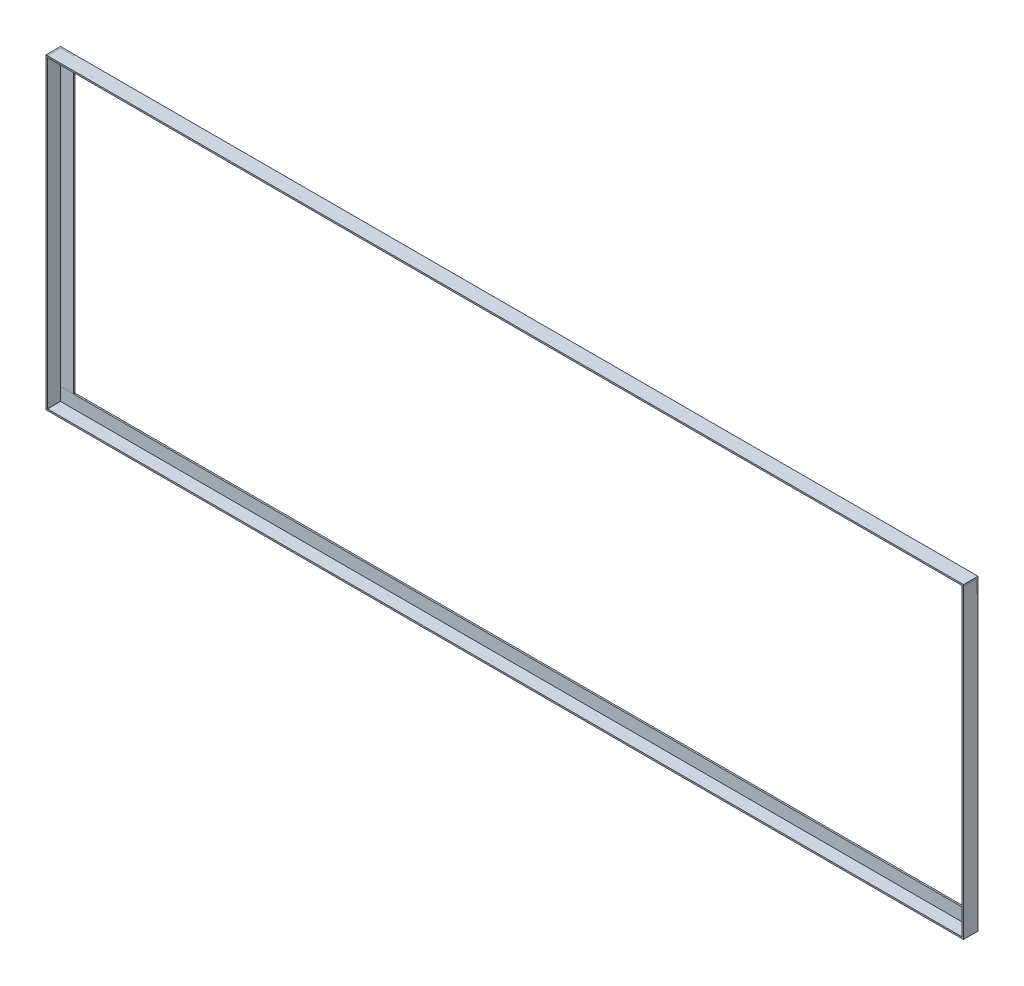
ISO-10303-21;
HEADER;
FILE_DESCRIPTION(('STEP AP214'),'2;1');
FILE_NAME('part.step','',(''),(''),'','','');
FILE_SCHEMA(('AUTOMOTIVE_DESIGN { 1 0 10303 214 1 1 1 1 }'));
ENDSEC;
DATA;
#1=APPLICATION_CONTEXT('core data for automotive mechanical design processes');
#2=APPLICATION_PROTOCOL_DEFINITION('international standard','automotive_design',2000,#1);
#3=PRODUCT_CONTEXT('',#1,'mechanical');
#4=PRODUCT('Part','Part','',(#3));
#5=PRODUCT_RELATED_PRODUCT_CATEGORY('part','',(#4));
#6=PRODUCT_DEFINITION_FORMATION('','',#4);
#7=PRODUCT_DEFINITION_CONTEXT('part definition',#1,'design');
#8=PRODUCT_DEFINITION('design','',#6,#7);
#9=PRODUCT_DEFINITION_SHAPE('','',#8);
#10=(LENGTH_UNIT() NAMED_UNIT(*) SI_UNIT(.MILLI.,.METRE.));
#11=(NAMED_UNIT(*) PLANE_ANGLE_UNIT() SI_UNIT($,.RADIAN.));
#12=(NAMED_UNIT(*) SI_UNIT($,.STERADIAN.) SOLID_ANGLE_UNIT());
#13=UNCERTAINTY_MEASURE_WITH_UNIT(LENGTH_MEASURE(1.E-05),#10,'distance_accuracy_value','');
#14=(GEOMETRIC_REPRESENTATION_CONTEXT(3) GLOBAL_UNCERTAINTY_ASSIGNED_CONTEXT((#13)) GLOBAL_UNIT_ASSIGNED_CONTEXT((#10,
#11,#12)) REPRESENTATION_CONTEXT('',''));
#15=CARTESIAN_POINT('',(0.,0.,0.));
#16=DIRECTION('',(0.,0.,1.));
#17=DIRECTION('',(1.,0.,0.));
#18=AXIS2_PLACEMENT_3D('',#15,#16,#17);
#19=CARTESIAN_POINT('',(0.,0.,0.));
#20=DIRECTION('',(0.,0.,-1.));
#21=DIRECTION('',(-1.,0.,0.));
#22=AXIS2_PLACEMENT_3D('',#19,#20,#21);
#23=PLANE('',#22);
#24=DIRECTION('',(1.,0.,0.));
#25=VECTOR('',#24,1.);
#26=CARTESIAN_POINT('',(0.,402.,0.));
#27=LINE('',#26,#25);
#28=CARTESIAN_POINT('',(0.,402.,0.));
#29=VERTEX_POINT('',#28);
#30=CARTESIAN_POINT('',(17.05,402.,0.));
#31=VERTEX_POINT('',#30);
#32=EDGE_CURVE('E153',#29,#31,#27,.T.);
#33=ORIENTED_EDGE('',*,*,#32,.F.);
#34=DIRECTION('',(0.,1.,0.));
#35=VECTOR('',#34,1.);
#36=CARTESIAN_POINT('',(0.,0.,0.));
#37=LINE('',#36,#35);
#38=CARTESIAN_POINT('',(0.,17.05,0.));
#39=VERTEX_POINT('',#38);
#40=EDGE_CURVE('E79',#39,#29,#37,.T.);
#41=ORIENTED_EDGE('',*,*,#40,.F.);
#42=DIRECTION('',(-1.,0.,0.));
#43=VECTOR('',#42,1.);
#44=CARTESIAN_POINT('',(0.,17.05,0.));
#45=LINE('',#44,#43);
#46=CARTESIAN_POINT('',(17.05,17.05,0.));
#47=VERTEX_POINT('',#46);
#48=EDGE_CURVE('E157',#47,#39,#45,.T.);
#49=ORIENTED_EDGE('',*,*,#48,.F.);
#50=DIRECTION('',(0.,1.,0.));
#51=VECTOR('',#50,1.);
#52=CARTESIAN_POINT('',(17.05,0.,0.));
#53=LINE('',#52,#51);
#54=EDGE_CURVE('E185',#47,#31,#53,.T.);
#55=ORIENTED_EDGE('',*,*,#54,.T.);
#56=EDGE_LOOP('',(#33,#41,#49,#55));
#57=FACE_BOUND('',#56,.T.);
#58=ADVANCED_FACE('F75',(#57),#23,.F.);
#59=CARTESIAN_POINT('',(17.05,0.,0.));
#60=DIRECTION('',(-1.,0.,0.));
#61=DIRECTION('',(0.,0.,1.));
#62=AXIS2_PLACEMENT_3D('',#59,#60,#61);
#63=PLANE('',#62);
#64=DIRECTION('',(0.,0.,-1.));
#65=VECTOR('',#64,1.);
#66=CARTESIAN_POINT('',(17.05,402.,0.));
#67=LINE('',#66,#65);
#68=CARTESIAN_POINT('',(17.05,402.,-2.));
#69=VERTEX_POINT('',#68);
#70=EDGE_CURVE('E172',#31,#69,#67,.T.);
#71=ORIENTED_EDGE('',*,*,#70,.F.);
#72=ORIENTED_EDGE('',*,*,#54,.F.);
#73=DIRECTION('',(0.,0.,1.));
#74=VECTOR('',#73,1.);
#75=CARTESIAN_POINT('',(17.05,17.05,0.));
#76=LINE('',#75,#74);
#77=CARTESIAN_POINT('',(17.05,17.05,-2.));
#78=VERTEX_POINT('',#77);
#79=EDGE_CURVE('E112',#78,#47,#76,.T.);
#80=ORIENTED_EDGE('',*,*,#79,.F.);
#81=DIRECTION('',(0.,1.,0.));
#82=VECTOR('',#81,1.);
#83=CARTESIAN_POINT('',(17.05,0.,-2.));
#84=LINE('',#83,#82);
#85=EDGE_CURVE('E165',#78,#69,#84,.T.);
#86=ORIENTED_EDGE('',*,*,#85,.T.);
#87=EDGE_LOOP('',(#71,#72,#80,#86));
#88=FACE_BOUND('',#87,.T.);
#89=ADVANCED_FACE('F212',(#88),#63,.F.);
#90=CARTESIAN_POINT('',(17.05,0.,-2.));
#91=DIRECTION('',(0.,0.,1.));
#92=DIRECTION('',(1.,0.,0.));
#93=AXIS2_PLACEMENT_3D('',#90,#91,#92);
#94=PLANE('',#93);
#95=DIRECTION('',(-1.,0.,0.));
#96=VECTOR('',#95,1.);
#97=CARTESIAN_POINT('',(17.0500000000001,402.,-2.));
#98=LINE('',#97,#96);
#99=CARTESIAN_POINT('',(-2.,402.,-2.));
#100=VERTEX_POINT('',#99);
#101=EDGE_CURVE('E169',#69,#100,#98,.T.);
#102=ORIENTED_EDGE('',*,*,#101,.F.);
#103=ORIENTED_EDGE('',*,*,#85,.F.);
#104=DIRECTION('',(-1.,0.,0.));
#105=VECTOR('',#104,1.);
#106=CARTESIAN_POINT('',(1202.,17.05,-1.99999999999992));
#107=LINE('',#106,#105);
#108=CARTESIAN_POINT('',(-2.,17.05,-2.));
#109=VERTEX_POINT('',#108);
#110=EDGE_CURVE('E109',#78,#109,#107,.T.);
#111=ORIENTED_EDGE('',*,*,#110,.T.);
#112=DIRECTION('',(0.,1.,0.));
#113=VECTOR('',#112,1.);
#114=CARTESIAN_POINT('',(-2.,0.,-2.));
#115=LINE('',#114,#113);
#116=EDGE_CURVE('E164',#109,#100,#115,.T.);
#117=ORIENTED_EDGE('',*,*,#116,.T.);
#118=EDGE_LOOP('',(#102,#103,#111,#117));
#119=FACE_BOUND('',#118,.T.);
#120=ADVANCED_FACE('F210',(#119),#94,.F.);
#121=CARTESIAN_POINT('',(-2.,0.,-2.));
#122=DIRECTION('',(1.,0.,0.));
#123=DIRECTION('',(0.,0.,-1.));
#124=AXIS2_PLACEMENT_3D('',#121,#122,#123);
#125=PLANE('',#124);
#126=DIRECTION('',(0.,0.,1.));
#127=VECTOR('',#126,1.);
#128=CARTESIAN_POINT('',(-2.,402.,-2.));
#129=LINE('',#128,#127);
#130=CARTESIAN_POINT('',(-2.,402.,17.05));
#131=VERTEX_POINT('',#130);
#132=EDGE_CURVE('E85',#100,#131,#129,.T.);
#133=ORIENTED_EDGE('',*,*,#132,.F.);
#134=ORIENTED_EDGE('',*,*,#116,.F.);
#135=DIRECTION('',(0.,0.,-1.));
#136=VECTOR('',#135,1.);
#137=CARTESIAN_POINT('',(-2.,17.05,-2.));
#138=LINE('',#137,#136);
#139=CARTESIAN_POINT('',(-2.,17.05,0.));
#140=VERTEX_POINT('',#139);
#141=EDGE_CURVE('E139',#140,#109,#138,.T.);
#142=ORIENTED_EDGE('',*,*,#141,.F.);
#143=DIRECTION('',(0.,1.,0.));
#144=VECTOR('',#143,1.);
#145=CARTESIAN_POINT('',(-2.,0.,0.));
#146=LINE('',#145,#144);
#147=CARTESIAN_POINT('',(-2.,0.,0.));
#148=VERTEX_POINT('',#147);
#149=EDGE_CURVE('E142',#148,#140,#146,.T.);
#150=ORIENTED_EDGE('',*,*,#149,.F.);
#151=DIRECTION('',(0.,0.,-1.));
#152=VECTOR('',#151,1.);
#153=CARTESIAN_POINT('',(-2.,0.,-2.));
#154=LINE('',#153,#152);
#155=CARTESIAN_POINT('',(-2.,0.,17.05));
#156=VERTEX_POINT('',#155);
#157=EDGE_CURVE('E128',#156,#148,#154,.T.);
#158=ORIENTED_EDGE('',*,*,#157,.F.);
#159=DIRECTION('',(0.,1.,0.));
#160=VECTOR('',#159,1.);
#161=CARTESIAN_POINT('',(-2.,0.,17.05));
#162=LINE('',#161,#160);
#163=EDGE_CURVE('E180',#156,#131,#162,.T.);
#164=ORIENTED_EDGE('',*,*,#163,.T.);
#165=EDGE_LOOP('',(#133,#134,#142,#150,#158,#164));
#166=FACE_BOUND('',#165,.T.);
#167=ADVANCED_FACE('F148',(#166),#125,.F.);
#168=CARTESIAN_POINT('',(-2.,0.,17.05));
#169=DIRECTION('',(0.,0.,-1.));
#170=DIRECTION('',(-1.,0.,0.));
#171=AXIS2_PLACEMENT_3D('',#168,#169,#170);
#172=PLANE('',#171);
#173=DIRECTION('',(1.,0.,0.));
#174=VECTOR('',#173,1.);
#175=CARTESIAN_POINT('',(-1.99999999999993,402.,17.05));
#176=LINE('',#175,#174);
#177=CARTESIAN_POINT('',(0.,402.,17.05));
#178=VERTEX_POINT('',#177);
#179=EDGE_CURVE('E14',#131,#178,#176,.T.);
#180=ORIENTED_EDGE('',*,*,#179,.F.);
#181=ORIENTED_EDGE('',*,*,#163,.F.);
#182=DIRECTION('',(-1.,0.,0.));
#183=VECTOR('',#182,1.);
#184=CARTESIAN_POINT('',(1202.,0.,17.0500000000001));
#185=LINE('',#184,#183);
#186=CARTESIAN_POINT('',(0.,0.,17.05));
#187=VERTEX_POINT('',#186);
#188=EDGE_CURVE('E134',#187,#156,#185,.T.);
#189=ORIENTED_EDGE('',*,*,#188,.F.);
#190=DIRECTION('',(0.,1.,0.));
#191=VECTOR('',#190,1.);
#192=CARTESIAN_POINT('',(0.,0.,17.05));
#193=LINE('',#192,#191);
#194=EDGE_CURVE('E177',#187,#178,#193,.T.);
#195=ORIENTED_EDGE('',*,*,#194,.T.);
#196=EDGE_LOOP('',(#180,#181,#189,#195));
#197=FACE_BOUND('',#196,.T.);
#198=ADVANCED_FACE('F223',(#197),#172,.F.);
#199=CARTESIAN_POINT('',(0.,0.,17.05));
#200=DIRECTION('',(-1.,0.,0.));
#201=DIRECTION('',(0.,0.,1.));
#202=AXIS2_PLACEMENT_3D('',#199,#200,#201);
#203=PLANE('',#202);
#204=DIRECTION('',(0.,0.,-1.));
#205=VECTOR('',#204,1.);
#206=CARTESIAN_POINT('',(0.,402.,17.05));
#207=LINE('',#206,#205);
#208=EDGE_CURVE('E150',#178,#29,#207,.T.);
#209=ORIENTED_EDGE('',*,*,#208,.F.);
#210=ORIENTED_EDGE('',*,*,#194,.F.);
#211=DIRECTION('',(0.,0.,1.));
#212=VECTOR('',#211,1.);
#213=CARTESIAN_POINT('',(0.,0.,17.05));
#214=LINE('',#213,#212);
#215=CARTESIAN_POINT('',(0.,0.,0.));
#216=VERTEX_POINT('',#215);
#217=EDGE_CURVE('E158',#216,#187,#214,.T.);
#218=ORIENTED_EDGE('',*,*,#217,.F.);
#219=EDGE_CURVE('E144',#216,#39,#37,.T.);
#220=ORIENTED_EDGE('',*,*,#219,.T.);
#221=ORIENTED_EDGE('',*,*,#40,.T.);
#222=EDGE_LOOP('',(#209,#210,#218,#220,#221));
#223=FACE_BOUND('',#222,.T.);
#224=ADVANCED_FACE('F203',(#223),#203,.F.);
#225=CARTESIAN_POINT('',(1202.,0.,17.0500000000001));
#226=DIRECTION('',(0.,-1.,0.));
#227=DIRECTION('',(0.,0.,-1.));
#228=AXIS2_PLACEMENT_3D('',#225,#226,#227);
#229=PLANE('',#228);
#230=ORIENTED_EDGE('',*,*,#217,.T.);
#231=ORIENTED_EDGE('',*,*,#188,.T.);
#232=ORIENTED_EDGE('',*,*,#157,.T.);
#233=DIRECTION('',(-1.,0.,0.));
#234=VECTOR('',#233,1.);
#235=CARTESIAN_POINT('',(1202.,0.,0.));
#236=LINE('',#235,#234);
#237=EDGE_CURVE('E131',#216,#148,#236,.T.);
#238=ORIENTED_EDGE('',*,*,#237,.F.);
#239=EDGE_LOOP('',(#230,#231,#232,#238));
#240=FACE_BOUND('',#239,.T.);
#241=ADVANCED_FACE('F130',(#240),#229,.T.);
#242=CARTESIAN_POINT('',(1202.,17.05,0.));
#243=DIRECTION('',(0.,-1.,0.));
#244=DIRECTION('',(0.,0.,-1.));
#245=AXIS2_PLACEMENT_3D('',#242,#243,#244);
#246=PLANE('',#245);
#247=ORIENTED_EDGE('',*,*,#141,.T.);
#248=ORIENTED_EDGE('',*,*,#110,.F.);
#249=ORIENTED_EDGE('',*,*,#79,.T.);
#250=ORIENTED_EDGE('',*,*,#48,.T.);
#251=DIRECTION('',(-1.,0.,0.));
#252=VECTOR('',#251,1.);
#253=CARTESIAN_POINT('',(1202.,17.05,0.));
#254=LINE('',#253,#252);
#255=EDGE_CURVE('E94',#39,#140,#254,.T.);
#256=ORIENTED_EDGE('',*,*,#255,.T.);
#257=EDGE_LOOP('',(#247,#248,#249,#250,#256));
#258=FACE_BOUND('',#257,.T.);
#259=ADVANCED_FACE('F228',(#258),#246,.T.);
#260=CARTESIAN_POINT('',(1202.,0.,0.));
#261=DIRECTION('',(0.,0.,-1.));
#262=DIRECTION('',(-1.,0.,0.));
#263=AXIS2_PLACEMENT_3D('',#260,#261,#262);
#264=PLANE('',#263);
#265=ORIENTED_EDGE('',*,*,#219,.F.);
#266=ORIENTED_EDGE('',*,*,#237,.T.);
#267=ORIENTED_EDGE('',*,*,#149,.T.);
#268=ORIENTED_EDGE('',*,*,#255,.F.);
#269=EDGE_LOOP('',(#265,#266,#267,#268));
#270=FACE_BOUND('',#269,.T.);
#271=ADVANCED_FACE('F141',(#270),#264,.T.);
#272=CARTESIAN_POINT('',(0.,402.,-2.));
#273=DIRECTION('',(0.,1.,0.));
#274=DIRECTION('',(-1.,0.,0.));
#275=AXIS2_PLACEMENT_3D('',#272,#273,#274);
#276=PLANE('',#275);
#277=ORIENTED_EDGE('',*,*,#208,.T.);
#278=ORIENTED_EDGE('',*,*,#32,.T.);
#279=ORIENTED_EDGE('',*,*,#70,.T.);
#280=ORIENTED_EDGE('',*,*,#101,.T.);
#281=ORIENTED_EDGE('',*,*,#132,.T.);
#282=ORIENTED_EDGE('',*,*,#179,.T.);
#283=EDGE_LOOP('',(#277,#278,#279,#280,#281,#282));
#284=FACE_BOUND('',#283,.T.);
#285=ADVANCED_FACE('F77',(#284),#276,.T.);
#286=CLOSED_SHELL('',(#58,#89,#120,#167,#198,#224,#241,#259,#271,#285));
#287=MANIFOLD_SOLID_BREP('B2',#286);
#288=CARTESIAN_POINT('',(1204.,400.,-1.99999999999995));
#289=DIRECTION('',(1.,0.,0.));
#290=DIRECTION('',(0.,1.,0.));
#291=AXIS2_PLACEMENT_3D('',#288,#289,#290);
#292=PLANE('',#291);
#293=DIRECTION('',(0.,-1.,0.));
#294=VECTOR('',#293,1.);
#295=CARTESIAN_POINT('',(1204.,402.,17.0500000000001));
#296=LINE('',#295,#294);
#297=CARTESIAN_POINT('',(1204.,402.,17.0500000000001));
#298=VERTEX_POINT('',#297);
#299=CARTESIAN_POINT('',(1204.,400.,17.0500000000001));
#300=VERTEX_POINT('',#299);
#301=EDGE_CURVE('E438',#298,#300,#296,.T.);
#302=ORIENTED_EDGE('',*,*,#301,.T.);
#303=DIRECTION('',(0.,0.,-1.));
#304=VECTOR('',#303,1.);
#305=CARTESIAN_POINT('',(1204.,400.,17.0500000000001));
#306=LINE('',#305,#304);
#307=CARTESIAN_POINT('',(1204.,400.,0.));
#308=VERTEX_POINT('',#307);
#309=EDGE_CURVE('E464',#300,#308,#306,.T.);
#310=ORIENTED_EDGE('',*,*,#309,.T.);
#311=DIRECTION('',(0.,-1.,0.));
#312=VECTOR('',#311,1.);
#313=CARTESIAN_POINT('',(1204.,400.,0.));
#314=LINE('',#313,#312);
#315=CARTESIAN_POINT('',(1204.,382.95,0.));
#316=VERTEX_POINT('',#315);
#317=EDGE_CURVE('E468',#308,#316,#314,.T.);
#318=ORIENTED_EDGE('',*,*,#317,.T.);
#319=DIRECTION('',(0.,0.,-1.));
#320=VECTOR('',#319,1.);
#321=CARTESIAN_POINT('',(1204.,382.95,0.));
#322=LINE('',#321,#320);
#323=CARTESIAN_POINT('',(1204.,382.95,-1.99999999999995));
#324=VERTEX_POINT('',#323);
#325=EDGE_CURVE('E477',#316,#324,#322,.T.);
#326=ORIENTED_EDGE('',*,*,#325,.T.);
#327=DIRECTION('',(0.,1.,0.));
#328=VECTOR('',#327,1.);
#329=CARTESIAN_POINT('',(1204.,382.95,-1.99999999999995));
#330=LINE('',#329,#328);
#331=CARTESIAN_POINT('',(1204.,402.,-1.99999999999995));
#332=VERTEX_POINT('',#331);
#333=EDGE_CURVE('E431',#324,#332,#330,.T.);
#334=ORIENTED_EDGE('',*,*,#333,.T.);
#335=DIRECTION('',(0.,0.,1.));
#336=VECTOR('',#335,1.);
#337=CARTESIAN_POINT('',(1204.,402.,-1.99999999999995));
#338=LINE('',#337,#336);
#339=EDGE_CURVE('E357',#332,#298,#338,.T.);
#340=ORIENTED_EDGE('',*,*,#339,.T.);
#341=EDGE_LOOP('',(#302,#310,#318,#326,#334,#340));
#342=FACE_BOUND('',#341,.T.);
#343=ADVANCED_FACE('F349',(#342),#292,.T.);
#344=CARTESIAN_POINT('',(-1.11022302462516E-13,400.,0.));
#345=DIRECTION('',(0.,0.,-1.));
#346=DIRECTION('',(-1.,0.,0.));
#347=AXIS2_PLACEMENT_3D('',#344,#345,#346);
#348=PLANE('',#347);
#349=DIRECTION('',(0.,1.,0.));
#350=VECTOR('',#349,1.);
#351=CARTESIAN_POINT('',(17.0499999999999,400.,0.));
#352=LINE('',#351,#350);
#353=CARTESIAN_POINT('',(17.0499999999998,382.95,0.));
#354=VERTEX_POINT('',#353);
#355=CARTESIAN_POINT('',(17.0499999999999,400.,0.));
#356=VERTEX_POINT('',#355);
#357=EDGE_CURVE('E73',#354,#356,#352,.T.);
#358=ORIENTED_EDGE('',*,*,#357,.F.);
#359=DIRECTION('',(1.,0.,0.));
#360=VECTOR('',#359,1.);
#361=CARTESIAN_POINT('',(-2.22044604925031E-13,382.95,0.));
#362=LINE('',#361,#360);
#363=EDGE_CURVE('E370',#354,#316,#362,.T.);
#364=ORIENTED_EDGE('',*,*,#363,.T.);
#365=ORIENTED_EDGE('',*,*,#317,.F.);
#366=DIRECTION('',(1.,0.,0.));
#367=VECTOR('',#366,1.);
#368=CARTESIAN_POINT('',(-1.11022302462516E-13,400.,0.));
#369=LINE('',#368,#367);
#370=EDGE_CURVE('E443',#356,#308,#369,.T.);
#371=ORIENTED_EDGE('',*,*,#370,.F.);
#372=EDGE_LOOP('',(#358,#364,#365,#371));
#373=FACE_BOUND('',#372,.T.);
#374=ADVANCED_FACE('F496',(#373),#348,.F.);
#375=CARTESIAN_POINT('',(-2.22044604925031E-13,382.95,0.));
#376=DIRECTION('',(0.,1.,0.));
#377=DIRECTION('',(0.,0.,1.));
#378=AXIS2_PLACEMENT_3D('',#375,#376,#377);
#379=PLANE('',#378);
#380=DIRECTION('',(0.,0.,1.));
#381=VECTOR('',#380,1.);
#382=CARTESIAN_POINT('',(17.0499999999998,382.95,0.));
#383=LINE('',#382,#381);
#384=CARTESIAN_POINT('',(17.0499999999999,382.95,-2.));
#385=VERTEX_POINT('',#384);
#386=EDGE_CURVE('E363',#385,#354,#383,.T.);
#387=ORIENTED_EDGE('',*,*,#386,.F.);
#388=DIRECTION('',(1.,0.,0.));
#389=VECTOR('',#388,1.);
#390=CARTESIAN_POINT('',(-2.22044604925031E-13,382.95,-2.));
#391=LINE('',#390,#389);
#392=EDGE_CURVE('E424',#385,#324,#391,.T.);
#393=ORIENTED_EDGE('',*,*,#392,.T.);
#394=ORIENTED_EDGE('',*,*,#325,.F.);
#395=ORIENTED_EDGE('',*,*,#363,.F.);
#396=EDGE_LOOP('',(#387,#393,#394,#395));
#397=FACE_BOUND('',#396,.T.);
#398=ADVANCED_FACE('F423',(#397),#379,.F.);
#399=CARTESIAN_POINT('',(-2.22044604925031E-13,382.95,-2.));
#400=DIRECTION('',(0.,0.,1.));
#401=DIRECTION('',(0.,-1.,0.));
#402=AXIS2_PLACEMENT_3D('',#399,#400,#401);
#403=PLANE('',#402);
#404=DIRECTION('',(0.,1.,0.));
#405=VECTOR('',#404,1.);
#406=CARTESIAN_POINT('',(17.0499999999999,-1.11022302462516E-13,-1.99999999999994));
#407=LINE('',#406,#405);
#408=CARTESIAN_POINT('',(17.05,402.,-2.));
#409=VERTEX_POINT('',#408);
#410=EDGE_CURVE('E410',#385,#409,#407,.T.);
#411=ORIENTED_EDGE('',*,*,#410,.T.);
#412=DIRECTION('',(1.,0.,0.));
#413=VECTOR('',#412,1.);
#414=CARTESIAN_POINT('',(-1.11022302462516E-13,402.,-2.));
#415=LINE('',#414,#413);
#416=EDGE_CURVE('E434',#409,#332,#415,.T.);
#417=ORIENTED_EDGE('',*,*,#416,.T.);
#418=ORIENTED_EDGE('',*,*,#333,.F.);
#419=ORIENTED_EDGE('',*,*,#392,.F.);
#420=EDGE_LOOP('',(#411,#417,#418,#419));
#421=FACE_BOUND('',#420,.T.);
#422=ADVANCED_FACE('F429',(#421),#403,.F.);
#423=CARTESIAN_POINT('',(-1.11022302462516E-13,402.,-2.));
#424=DIRECTION('',(0.,-1.,0.));
#425=DIRECTION('',(0.,0.,-1.));
#426=AXIS2_PLACEMENT_3D('',#423,#424,#425);
#427=PLANE('',#426);
#428=DIRECTION('',(0.,0.,-1.));
#429=VECTOR('',#428,1.);
#430=CARTESIAN_POINT('',(-1.11022302462516E-13,402.,-2.));
#431=LINE('',#430,#429);
#432=CARTESIAN_POINT('',(-1.11022302462516E-13,402.,17.05));
#433=VERTEX_POINT('',#432);
#434=CARTESIAN_POINT('',(-1.11022302462516E-13,402.,0.));
#435=VERTEX_POINT('',#434);
#436=EDGE_CURVE('E460',#433,#435,#431,.T.);
#437=ORIENTED_EDGE('',*,*,#436,.F.);
#438=DIRECTION('',(1.,0.,0.));
#439=VECTOR('',#438,1.);
#440=CARTESIAN_POINT('',(-1.11022302462516E-13,402.,17.05));
#441=LINE('',#440,#439);
#442=EDGE_CURVE('E440',#433,#298,#441,.T.);
#443=ORIENTED_EDGE('',*,*,#442,.T.);
#444=ORIENTED_EDGE('',*,*,#339,.F.);
#445=ORIENTED_EDGE('',*,*,#416,.F.);
#446=DIRECTION('',(0.,0.,-1.));
#447=VECTOR('',#446,1.);
#448=CARTESIAN_POINT('',(17.05,402.,-2.));
#449=LINE('',#448,#447);
#450=CARTESIAN_POINT('',(17.0499999999999,402.,0.));
#451=VERTEX_POINT('',#450);
#452=EDGE_CURVE('E414',#451,#409,#449,.T.);
#453=ORIENTED_EDGE('',*,*,#452,.F.);
#454=DIRECTION('',(1.,0.,0.));
#455=VECTOR('',#454,1.);
#456=CARTESIAN_POINT('',(-1.11022302462516E-13,402.,0.));
#457=LINE('',#456,#455);
#458=EDGE_CURVE('E446',#435,#451,#457,.T.);
#459=ORIENTED_EDGE('',*,*,#458,.F.);
#460=EDGE_LOOP('',(#437,#443,#444,#445,#453,#459));
#461=FACE_BOUND('',#460,.T.);
#462=ADVANCED_FACE('F490',(#461),#427,.F.);
#463=CARTESIAN_POINT('',(-1.11022302462516E-13,402.,17.05));
#464=DIRECTION('',(0.,0.,-1.));
#465=DIRECTION('',(-1.,0.,0.));
#466=AXIS2_PLACEMENT_3D('',#463,#464,#465);
#467=PLANE('',#466);
#468=DIRECTION('',(0.,1.,0.));
#469=VECTOR('',#468,1.);
#470=CARTESIAN_POINT('',(-2.22044604925031E-13,-1.11022302462516E-13,17.0500000000001));
#471=LINE('',#470,#469);
#472=CARTESIAN_POINT('',(-2.22044604925031E-13,400.,17.05));
#473=VERTEX_POINT('',#472);
#474=EDGE_CURVE('E419',#473,#433,#471,.T.);
#475=ORIENTED_EDGE('',*,*,#474,.F.);
#476=DIRECTION('',(1.,0.,0.));
#477=VECTOR('',#476,1.);
#478=CARTESIAN_POINT('',(-2.22044604925031E-13,400.,17.05));
#479=LINE('',#478,#477);
#480=EDGE_CURVE('E453',#473,#300,#479,.T.);
#481=ORIENTED_EDGE('',*,*,#480,.T.);
#482=ORIENTED_EDGE('',*,*,#301,.F.);
#483=ORIENTED_EDGE('',*,*,#442,.F.);
#484=EDGE_LOOP('',(#475,#481,#482,#483));
#485=FACE_BOUND('',#484,.T.);
#486=ADVANCED_FACE('F493',(#485),#467,.F.);
#487=CARTESIAN_POINT('',(-2.22044604925031E-13,400.,17.05));
#488=DIRECTION('',(0.,1.,0.));
#489=DIRECTION('',(0.,0.,1.));
#490=AXIS2_PLACEMENT_3D('',#487,#488,#489);
#491=PLANE('',#490);
#492=DIRECTION('',(0.,0.,1.));
#493=VECTOR('',#492,1.);
#494=CARTESIAN_POINT('',(-2.22044604925031E-13,400.,17.05));
#495=LINE('',#494,#493);
#496=CARTESIAN_POINT('',(-1.11022302462516E-13,400.,0.));
#497=VERTEX_POINT('',#496);
#498=EDGE_CURVE('E454',#497,#473,#495,.T.);
#499=ORIENTED_EDGE('',*,*,#498,.F.);
#500=EDGE_CURVE('E445',#497,#356,#369,.T.);
#501=ORIENTED_EDGE('',*,*,#500,.T.);
#502=ORIENTED_EDGE('',*,*,#370,.T.);
#503=ORIENTED_EDGE('',*,*,#309,.F.);
#504=ORIENTED_EDGE('',*,*,#480,.F.);
#505=EDGE_LOOP('',(#499,#501,#502,#503,#504));
#506=FACE_BOUND('',#505,.T.);
#507=ADVANCED_FACE('F498',(#506),#491,.F.);
#508=CARTESIAN_POINT('',(-2.22044604925031E-13,-1.11022302462516E-13,17.0500000000001));
#509=DIRECTION('',(-1.,0.,0.));
#510=DIRECTION('',(0.,0.,1.));
#511=AXIS2_PLACEMENT_3D('',#508,#509,#510);
#512=PLANE('',#511);
#513=ORIENTED_EDGE('',*,*,#498,.T.);
#514=ORIENTED_EDGE('',*,*,#474,.T.);
#515=ORIENTED_EDGE('',*,*,#436,.T.);
#516=DIRECTION('',(0.,1.,0.));
#517=VECTOR('',#516,1.);
#518=CARTESIAN_POINT('',(-2.22044604925031E-13,-1.11022302462516E-13,0.));
#519=LINE('',#518,#517);
#520=EDGE_CURVE('E427',#497,#435,#519,.T.);
#521=ORIENTED_EDGE('',*,*,#520,.F.);
#522=EDGE_LOOP('',(#513,#514,#515,#521));
#523=FACE_BOUND('',#522,.T.);
#524=ADVANCED_FACE('F502',(#523),#512,.T.);
#525=CARTESIAN_POINT('',(17.0499999999999,-1.11022302462516E-13,0.));
#526=DIRECTION('',(-1.,0.,0.));
#527=DIRECTION('',(0.,0.,1.));
#528=AXIS2_PLACEMENT_3D('',#525,#526,#527);
#529=PLANE('',#528);
#530=ORIENTED_EDGE('',*,*,#452,.T.);
#531=ORIENTED_EDGE('',*,*,#410,.F.);
#532=ORIENTED_EDGE('',*,*,#386,.T.);
#533=ORIENTED_EDGE('',*,*,#357,.T.);
#534=DIRECTION('',(0.,1.,0.));
#535=VECTOR('',#534,1.);
#536=CARTESIAN_POINT('',(17.0499999999999,-1.11022302462516E-13,0.));
#537=LINE('',#536,#535);
#538=EDGE_CURVE('E420',#356,#451,#537,.T.);
#539=ORIENTED_EDGE('',*,*,#538,.T.);
#540=EDGE_LOOP('',(#530,#531,#532,#533,#539));
#541=FACE_BOUND('',#540,.T.);
#542=ADVANCED_FACE('F411',(#541),#529,.T.);
#543=CARTESIAN_POINT('',(-2.22044604925031E-13,-1.11022302462516E-13,0.));
#544=DIRECTION('',(0.,0.,-1.));
#545=DIRECTION('',(-1.,0.,0.));
#546=AXIS2_PLACEMENT_3D('',#543,#544,#545);
#547=PLANE('',#546);
#548=ORIENTED_EDGE('',*,*,#500,.F.);
#549=ORIENTED_EDGE('',*,*,#520,.T.);
#550=ORIENTED_EDGE('',*,*,#458,.T.);
#551=ORIENTED_EDGE('',*,*,#538,.F.);
#552=EDGE_LOOP('',(#548,#549,#550,#551));
#553=FACE_BOUND('',#552,.T.);
#554=ADVANCED_FACE('F500',(#553),#547,.T.);
#555=CLOSED_SHELL('',(#343,#374,#398,#422,#462,#486,#507,#524,#542,#554));
#556=MANIFOLD_SOLID_BREP('B8',#555);
#557=CARTESIAN_POINT('',(1202.,0.,0.));
#558=DIRECTION('',(0.,0.,-1.));
#559=DIRECTION('',(-1.,0.,0.));
#560=AXIS2_PLACEMENT_3D('',#557,#558,#559);
#561=PLANE('',#560);
#562=DIRECTION('',(0.,1.,0.));
#563=VECTOR('',#562,1.);
#564=CARTESIAN_POINT('',(-2.,0.,0.));
#565=LINE('',#564,#563);
#566=CARTESIAN_POINT('',(-2.,0.,-2.63677968348475E-13));
#567=VERTEX_POINT('',#566);
#568=CARTESIAN_POINT('',(-2.00000000000011,17.05,0.));
#569=VERTEX_POINT('',#568);
#570=EDGE_CURVE('E723',#567,#569,#565,.T.);
#571=ORIENTED_EDGE('',*,*,#570,.F.);
#572=DIRECTION('',(-1.,0.,0.));
#573=VECTOR('',#572,1.);
#574=CARTESIAN_POINT('',(1202.,0.,0.));
#575=LINE('',#574,#573);
#576=CARTESIAN_POINT('',(1184.95,0.,0.));
#577=VERTEX_POINT('',#576);
#578=EDGE_CURVE('E649',#577,#567,#575,.T.);
#579=ORIENTED_EDGE('',*,*,#578,.F.);
#580=DIRECTION('',(0.,-1.,0.));
#581=VECTOR('',#580,1.);
#582=CARTESIAN_POINT('',(1184.95,0.,0.));
#583=LINE('',#582,#581);
#584=CARTESIAN_POINT('',(1184.95,17.05,0.));
#585=VERTEX_POINT('',#584);
#586=EDGE_CURVE('E727',#585,#577,#583,.T.);
#587=ORIENTED_EDGE('',*,*,#586,.F.);
#588=DIRECTION('',(-1.,0.,0.));
#589=VECTOR('',#588,1.);
#590=CARTESIAN_POINT('',(1202.,17.05,0.));
#591=LINE('',#590,#589);
#592=EDGE_CURVE('E755',#585,#569,#591,.T.);
#593=ORIENTED_EDGE('',*,*,#592,.T.);
#594=EDGE_LOOP('',(#571,#579,#587,#593));
#595=FACE_BOUND('',#594,.T.);
#596=ADVANCED_FACE('F645',(#595),#561,.F.);
#597=CARTESIAN_POINT('',(1202.,17.05,0.));
#598=DIRECTION('',(0.,-1.,0.));
#599=DIRECTION('',(0.,0.,-1.));
#600=AXIS2_PLACEMENT_3D('',#597,#598,#599);
#601=PLANE('',#600);
#602=DIRECTION('',(0.,0.,-1.));
#603=VECTOR('',#602,1.);
#604=CARTESIAN_POINT('',(-2.00000000000011,17.05,0.));
#605=LINE('',#604,#603);
#606=CARTESIAN_POINT('',(-2.,17.05,-2.));
#607=VERTEX_POINT('',#606);
#608=EDGE_CURVE('E742',#569,#607,#605,.T.);
#609=ORIENTED_EDGE('',*,*,#608,.F.);
#610=ORIENTED_EDGE('',*,*,#592,.F.);
#611=DIRECTION('',(0.,0.,1.));
#612=VECTOR('',#611,1.);
#613=CARTESIAN_POINT('',(1184.95,17.05,0.));
#614=LINE('',#613,#612);
#615=CARTESIAN_POINT('',(1184.95,17.05,-1.99999999999995));
#616=VERTEX_POINT('',#615);
#617=EDGE_CURVE('E682',#616,#585,#614,.T.);
#618=ORIENTED_EDGE('',*,*,#617,.F.);
#619=DIRECTION('',(-1.,0.,0.));
#620=VECTOR('',#619,1.);
#621=CARTESIAN_POINT('',(1202.,17.05,-1.99999999999995));
#622=LINE('',#621,#620);
#623=EDGE_CURVE('E735',#616,#607,#622,.T.);
#624=ORIENTED_EDGE('',*,*,#623,.T.);
#625=EDGE_LOOP('',(#609,#610,#618,#624));
#626=FACE_BOUND('',#625,.T.);
#627=ADVANCED_FACE('F782',(#626),#601,.F.);
#628=CARTESIAN_POINT('',(1202.,17.05,-1.99999999999995));
#629=DIRECTION('',(0.,0.,1.));
#630=DIRECTION('',(0.,-1.,0.));
#631=AXIS2_PLACEMENT_3D('',#628,#629,#630);
#632=PLANE('',#631);
#633=DIRECTION('',(0.,-1.,0.));
#634=VECTOR('',#633,1.);
#635=CARTESIAN_POINT('',(-2.,17.05,-2.));
#636=LINE('',#635,#634);
#637=CARTESIAN_POINT('',(-2.00000000000011,-2.,-2.));
#638=VERTEX_POINT('',#637);
#639=EDGE_CURVE('E739',#607,#638,#636,.T.);
#640=ORIENTED_EDGE('',*,*,#639,.F.);
#641=ORIENTED_EDGE('',*,*,#623,.F.);
#642=DIRECTION('',(0.,-1.,0.));
#643=VECTOR('',#642,1.);
#644=CARTESIAN_POINT('',(1184.95,400.,-1.99999999999998));
#645=LINE('',#644,#643);
#646=CARTESIAN_POINT('',(1184.95,-2.,-1.99999999999995));
#647=VERTEX_POINT('',#646);
#648=EDGE_CURVE('E679',#616,#647,#645,.T.);
#649=ORIENTED_EDGE('',*,*,#648,.T.);
#650=DIRECTION('',(-1.,0.,0.));
#651=VECTOR('',#650,1.);
#652=CARTESIAN_POINT('',(1202.,-2.,-1.99999999999995));
#653=LINE('',#652,#651);
#654=EDGE_CURVE('E734',#647,#638,#653,.T.);
#655=ORIENTED_EDGE('',*,*,#654,.T.);
#656=EDGE_LOOP('',(#640,#641,#649,#655));
#657=FACE_BOUND('',#656,.T.);
#658=ADVANCED_FACE('F780',(#657),#632,.F.);
#659=CARTESIAN_POINT('',(1202.,-2.,-1.99999999999995));
#660=DIRECTION('',(0.,1.,0.));
#661=DIRECTION('',(0.,0.,1.));
#662=AXIS2_PLACEMENT_3D('',#659,#660,#661);
#663=PLANE('',#662);
#664=DIRECTION('',(0.,0.,1.));
#665=VECTOR('',#664,1.);
#666=CARTESIAN_POINT('',(-2.00000000000011,-2.,-2.));
#667=LINE('',#666,#665);
#668=CARTESIAN_POINT('',(-2.00000000000011,-2.,17.05));
#669=VERTEX_POINT('',#668);
#670=EDGE_CURVE('E655',#638,#669,#667,.T.);
#671=ORIENTED_EDGE('',*,*,#670,.F.);
#672=ORIENTED_EDGE('',*,*,#654,.F.);
#673=DIRECTION('',(0.,0.,-1.));
#674=VECTOR('',#673,1.);
#675=CARTESIAN_POINT('',(1184.95,-2.,-1.99999999999995));
#676=LINE('',#675,#674);
#677=CARTESIAN_POINT('',(1184.95,-2.,0.));
#678=VERTEX_POINT('',#677);
#679=EDGE_CURVE('E709',#678,#647,#676,.T.);
#680=ORIENTED_EDGE('',*,*,#679,.F.);
#681=DIRECTION('',(-1.,0.,0.));
#682=VECTOR('',#681,1.);
#683=CARTESIAN_POINT('',(1202.,-2.,0.));
#684=LINE('',#683,#682);
#685=CARTESIAN_POINT('',(1202.,-2.,0.));
#686=VERTEX_POINT('',#685);
#687=EDGE_CURVE('E712',#686,#678,#684,.T.);
#688=ORIENTED_EDGE('',*,*,#687,.F.);
#689=DIRECTION('',(0.,0.,-1.));
#690=VECTOR('',#689,1.);
#691=CARTESIAN_POINT('',(1202.,-2.,-1.99999999999995));
#692=LINE('',#691,#690);
#693=CARTESIAN_POINT('',(1202.,-2.,17.0500000000001));
#694=VERTEX_POINT('',#693);
#695=EDGE_CURVE('E698',#694,#686,#692,.T.);
#696=ORIENTED_EDGE('',*,*,#695,.F.);
#697=DIRECTION('',(-1.,0.,0.));
#698=VECTOR('',#697,1.);
#699=CARTESIAN_POINT('',(1202.,-2.,17.0500000000001));
#700=LINE('',#699,#698);
#701=EDGE_CURVE('E750',#694,#669,#700,.T.);
#702=ORIENTED_EDGE('',*,*,#701,.T.);
#703=EDGE_LOOP('',(#671,#672,#680,#688,#696,#702));
#704=FACE_BOUND('',#703,.T.);
#705=ADVANCED_FACE('F718',(#704),#663,.F.);
#706=CARTESIAN_POINT('',(1202.,-2.,17.0500000000001));
#707=DIRECTION('',(0.,0.,-1.));
#708=DIRECTION('',(-1.,0.,0.));
#709=AXIS2_PLACEMENT_3D('',#706,#707,#708);
#710=PLANE('',#709);
#711=DIRECTION('',(0.,1.,0.));
#712=VECTOR('',#711,1.);
#713=CARTESIAN_POINT('',(-2.00000000000011,-2.,17.05));
#714=LINE('',#713,#712);
#715=CARTESIAN_POINT('',(-2.,0.,17.05));
#716=VERTEX_POINT('',#715);
#717=EDGE_CURVE('E347',#669,#716,#714,.T.);
#718=ORIENTED_EDGE('',*,*,#717,.F.);
#719=ORIENTED_EDGE('',*,*,#701,.F.);
#720=DIRECTION('',(0.,-1.,0.));
#721=VECTOR('',#720,1.);
#722=CARTESIAN_POINT('',(1202.,400.,17.0500000000001));
#723=LINE('',#722,#721);
#724=CARTESIAN_POINT('',(1202.,0.,17.0500000000001));
#725=VERTEX_POINT('',#724);
#726=EDGE_CURVE('E704',#725,#694,#723,.T.);
#727=ORIENTED_EDGE('',*,*,#726,.F.);
#728=DIRECTION('',(-1.,0.,0.));
#729=VECTOR('',#728,1.);
#730=CARTESIAN_POINT('',(1202.,0.,17.0500000000001));
#731=LINE('',#730,#729);
#732=EDGE_CURVE('E747',#725,#716,#731,.T.);
#733=ORIENTED_EDGE('',*,*,#732,.T.);
#734=EDGE_LOOP('',(#718,#719,#727,#733));
#735=FACE_BOUND('',#734,.T.);
#736=ADVANCED_FACE('F793',(#735),#710,.F.);
#737=CARTESIAN_POINT('',(1202.,0.,17.0500000000001));
#738=DIRECTION('',(0.,-1.,0.));
#739=DIRECTION('',(0.,0.,-1.));
#740=AXIS2_PLACEMENT_3D('',#737,#738,#739);
#741=PLANE('',#740);
#742=DIRECTION('',(0.,0.,-1.));
#743=VECTOR('',#742,1.);
#744=CARTESIAN_POINT('',(-2.,0.,17.05));
#745=LINE('',#744,#743);
#746=EDGE_CURVE('E720',#716,#567,#745,.T.);
#747=ORIENTED_EDGE('',*,*,#746,.F.);
#748=ORIENTED_EDGE('',*,*,#732,.F.);
#749=DIRECTION('',(0.,0.,1.));
#750=VECTOR('',#749,1.);
#751=CARTESIAN_POINT('',(1202.,0.,17.0500000000001));
#752=LINE('',#751,#750);
#753=CARTESIAN_POINT('',(1202.,0.,0.));
#754=VERTEX_POINT('',#753);
#755=EDGE_CURVE('E728',#754,#725,#752,.T.);
#756=ORIENTED_EDGE('',*,*,#755,.F.);
#757=EDGE_CURVE('E714',#754,#577,#575,.T.);
#758=ORIENTED_EDGE('',*,*,#757,.T.);
#759=ORIENTED_EDGE('',*,*,#578,.T.);
#760=EDGE_LOOP('',(#747,#748,#756,#758,#759));
#761=FACE_BOUND('',#760,.T.);
#762=ADVANCED_FACE('F773',(#761),#741,.F.);
#763=CARTESIAN_POINT('',(1202.,400.,17.0500000000001));
#764=DIRECTION('',(1.,0.,0.));
#765=DIRECTION('',(0.,0.,-1.));
#766=AXIS2_PLACEMENT_3D('',#763,#764,#765);
#767=PLANE('',#766);
#768=ORIENTED_EDGE('',*,*,#755,.T.);
#769=ORIENTED_EDGE('',*,*,#726,.T.);
#770=ORIENTED_EDGE('',*,*,#695,.T.);
#771=DIRECTION('',(0.,-1.,0.));
#772=VECTOR('',#771,1.);
#773=CARTESIAN_POINT('',(1202.,400.,0.));
#774=LINE('',#773,#772);
#775=EDGE_CURVE('E701',#754,#686,#774,.T.);
#776=ORIENTED_EDGE('',*,*,#775,.F.);
#777=EDGE_LOOP('',(#768,#769,#770,#776));
#778=FACE_BOUND('',#777,.T.);
#779=ADVANCED_FACE('F700',(#778),#767,.T.);
#780=CARTESIAN_POINT('',(1184.95,400.,0.));
#781=DIRECTION('',(1.,0.,0.));
#782=DIRECTION('',(0.,0.,-1.));
#783=AXIS2_PLACEMENT_3D('',#780,#781,#782);
#784=PLANE('',#783);
#785=ORIENTED_EDGE('',*,*,#679,.T.);
#786=ORIENTED_EDGE('',*,*,#648,.F.);
#787=ORIENTED_EDGE('',*,*,#617,.T.);
#788=ORIENTED_EDGE('',*,*,#586,.T.);
#789=DIRECTION('',(0.,-1.,0.));
#790=VECTOR('',#789,1.);
#791=CARTESIAN_POINT('',(1184.95,400.,0.));
#792=LINE('',#791,#790);
#793=EDGE_CURVE('E664',#577,#678,#792,.T.);
#794=ORIENTED_EDGE('',*,*,#793,.T.);
#795=EDGE_LOOP('',(#785,#786,#787,#788,#794));
#796=FACE_BOUND('',#795,.T.);
#797=ADVANCED_FACE('F798',(#796),#784,.T.);
#798=CARTESIAN_POINT('',(1202.,400.,0.));
#799=DIRECTION('',(0.,0.,-1.));
#800=DIRECTION('',(-1.,0.,0.));
#801=AXIS2_PLACEMENT_3D('',#798,#799,#800);
#802=PLANE('',#801);
#803=ORIENTED_EDGE('',*,*,#757,.F.);
#804=ORIENTED_EDGE('',*,*,#775,.T.);
#805=ORIENTED_EDGE('',*,*,#687,.T.);
#806=ORIENTED_EDGE('',*,*,#793,.F.);
#807=EDGE_LOOP('',(#803,#804,#805,#806));
#808=FACE_BOUND('',#807,.T.);
#809=ADVANCED_FACE('F711',(#808),#802,.T.);
#810=CARTESIAN_POINT('',(-2.00000000000011,0.,-2.));
#811=DIRECTION('',(-1.,0.,0.));
#812=DIRECTION('',(0.,0.,1.));
#813=AXIS2_PLACEMENT_3D('',#810,#811,#812);
#814=PLANE('',#813);
#815=ORIENTED_EDGE('',*,*,#746,.T.);
#816=ORIENTED_EDGE('',*,*,#570,.T.);
#817=ORIENTED_EDGE('',*,*,#608,.T.);
#818=ORIENTED_EDGE('',*,*,#639,.T.);
#819=ORIENTED_EDGE('',*,*,#670,.T.);
#820=ORIENTED_EDGE('',*,*,#717,.T.);
#821=EDGE_LOOP('',(#815,#816,#817,#818,#819,#820));
#822=FACE_BOUND('',#821,.T.);
#823=ADVANCED_FACE('F647',(#822),#814,.T.);
#824=CLOSED_SHELL('',(#596,#627,#658,#705,#736,#762,#779,#797,#809,#823));
#825=MANIFOLD_SOLID_BREP('B67',#824);
#826=CARTESIAN_POINT('',(1202.,400.,0.));
#827=DIRECTION('',(0.,0.,-1.));
#828=DIRECTION('',(-1.,0.,0.));
#829=AXIS2_PLACEMENT_3D('',#826,#827,#828);
#830=PLANE('',#829);
#831=DIRECTION('',(-1.,0.,0.));
#832=VECTOR('',#831,1.);
#833=CARTESIAN_POINT('',(1202.,-2.00000000000003,0.));
#834=LINE('',#833,#832);
#835=CARTESIAN_POINT('',(1202.,-2.00000000000003,0.));
#836=VERTEX_POINT('',#835);
#837=CARTESIAN_POINT('',(1184.95,-2.00000000000003,0.));
#838=VERTEX_POINT('',#837);
#839=EDGE_CURVE('E987',#836,#838,#834,.T.);
#840=ORIENTED_EDGE('',*,*,#839,.F.);
#841=DIRECTION('',(0.,-1.,0.));
#842=VECTOR('',#841,1.);
#843=CARTESIAN_POINT('',(1202.,400.,0.));
#844=LINE('',#843,#842);
#845=CARTESIAN_POINT('',(1202.,382.95,0.));
#846=VERTEX_POINT('',#845);
#847=EDGE_CURVE('E913',#846,#836,#844,.T.);
#848=ORIENTED_EDGE('',*,*,#847,.F.);
#849=DIRECTION('',(1.,0.,0.));
#850=VECTOR('',#849,1.);
#851=CARTESIAN_POINT('',(1202.,382.95,0.));
#852=LINE('',#851,#850);
#853=CARTESIAN_POINT('',(1184.95,382.95,0.));
#854=VERTEX_POINT('',#853);
#855=EDGE_CURVE('E991',#854,#846,#852,.T.);
#856=ORIENTED_EDGE('',*,*,#855,.F.);
#857=DIRECTION('',(0.,-1.,0.));
#858=VECTOR('',#857,1.);
#859=CARTESIAN_POINT('',(1184.95,400.,0.));
#860=LINE('',#859,#858);
#861=EDGE_CURVE('E1019',#854,#838,#860,.T.);
#862=ORIENTED_EDGE('',*,*,#861,.T.);
#863=EDGE_LOOP('',(#840,#848,#856,#862));
#864=FACE_BOUND('',#863,.T.);
#865=ADVANCED_FACE('F909',(#864),#830,.F.);
#866=CARTESIAN_POINT('',(1184.95,400.,0.));
#867=DIRECTION('',(1.,0.,0.));
#868=DIRECTION('',(0.,0.,-1.));
#869=AXIS2_PLACEMENT_3D('',#866,#867,#868);
#870=PLANE('',#869);
#871=DIRECTION('',(0.,0.,-1.));
#872=VECTOR('',#871,1.);
#873=CARTESIAN_POINT('',(1184.95,-2.00000000000003,0.));
#874=LINE('',#873,#872);
#875=CARTESIAN_POINT('',(1184.95,-2.00000000000006,-1.99999999999995));
#876=VERTEX_POINT('',#875);
#877=EDGE_CURVE('E1006',#838,#876,#874,.T.);
#878=ORIENTED_EDGE('',*,*,#877,.F.);
#879=ORIENTED_EDGE('',*,*,#861,.F.);
#880=DIRECTION('',(0.,0.,1.));
#881=VECTOR('',#880,1.);
#882=CARTESIAN_POINT('',(1184.95,382.95,0.));
#883=LINE('',#882,#881);
#884=CARTESIAN_POINT('',(1184.95,382.95,-1.99999999999995));
#885=VERTEX_POINT('',#884);
#886=EDGE_CURVE('E946',#885,#854,#883,.T.);
#887=ORIENTED_EDGE('',*,*,#886,.F.);
#888=DIRECTION('',(0.,-1.,0.));
#889=VECTOR('',#888,1.);
#890=CARTESIAN_POINT('',(1184.95,400.,-1.99999999999995));
#891=LINE('',#890,#889);
#892=EDGE_CURVE('E999',#885,#876,#891,.T.);
#893=ORIENTED_EDGE('',*,*,#892,.T.);
#894=EDGE_LOOP('',(#878,#879,#887,#893));
#895=FACE_BOUND('',#894,.T.);
#896=ADVANCED_FACE('F1046',(#895),#870,.F.);
#897=CARTESIAN_POINT('',(1184.95,400.,-1.99999999999995));
#898=DIRECTION('',(0.,0.,1.));
#899=DIRECTION('',(1.,0.,0.));
#900=AXIS2_PLACEMENT_3D('',#897,#898,#899);
#901=PLANE('',#900);
#902=DIRECTION('',(1.,0.,0.));
#903=VECTOR('',#902,1.);
#904=CARTESIAN_POINT('',(1184.95,-2.00000000000006,-1.99999999999995));
#905=LINE('',#904,#903);
#906=CARTESIAN_POINT('',(1204.,-2.00000000000003,-1.99999999999995));
#907=VERTEX_POINT('',#906);
#908=EDGE_CURVE('E1003',#876,#907,#905,.T.);
#909=ORIENTED_EDGE('',*,*,#908,.F.);
#910=ORIENTED_EDGE('',*,*,#892,.F.);
#911=DIRECTION('',(1.,0.,0.));
#912=VECTOR('',#911,1.);
#913=CARTESIAN_POINT('',(-2.22044604925031E-13,382.95,-2.00000000000009));
#914=LINE('',#913,#912);
#915=CARTESIAN_POINT('',(1204.,382.95,-1.99999999999995));
#916=VERTEX_POINT('',#915);
#917=EDGE_CURVE('E943',#885,#916,#914,.T.);
#918=ORIENTED_EDGE('',*,*,#917,.T.);
#919=DIRECTION('',(0.,-1.,0.));
#920=VECTOR('',#919,1.);
#921=CARTESIAN_POINT('',(1204.,400.,-1.99999999999995));
#922=LINE('',#921,#920);
#923=EDGE_CURVE('E998',#916,#907,#922,.T.);
#924=ORIENTED_EDGE('',*,*,#923,.T.);
#925=EDGE_LOOP('',(#909,#910,#918,#924));
#926=FACE_BOUND('',#925,.T.);
#927=ADVANCED_FACE('F1044',(#926),#901,.F.);
#928=CARTESIAN_POINT('',(1204.,400.,-1.99999999999995));
#929=DIRECTION('',(-1.,0.,0.));
#930=DIRECTION('',(0.,0.,1.));
#931=AXIS2_PLACEMENT_3D('',#928,#929,#930);
#932=PLANE('',#931);
#933=DIRECTION('',(0.,0.,1.));
#934=VECTOR('',#933,1.);
#935=CARTESIAN_POINT('',(1204.,-2.00000000000003,-1.99999999999995));
#936=LINE('',#935,#934);
#937=CARTESIAN_POINT('',(1204.,-2.00000000000003,17.0500000000001));
#938=VERTEX_POINT('',#937);
#939=EDGE_CURVE('E919',#907,#938,#936,.T.);
#940=ORIENTED_EDGE('',*,*,#939,.F.);
#941=ORIENTED_EDGE('',*,*,#923,.F.);
#942=DIRECTION('',(0.,0.,-1.));
#943=VECTOR('',#942,1.);
#944=CARTESIAN_POINT('',(1204.,382.95,-1.99999999999995));
#945=LINE('',#944,#943);
#946=CARTESIAN_POINT('',(1204.,382.95,0.));
#947=VERTEX_POINT('',#946);
#948=EDGE_CURVE('E973',#947,#916,#945,.T.);
#949=ORIENTED_EDGE('',*,*,#948,.F.);
#950=DIRECTION('',(0.,-1.,0.));
#951=VECTOR('',#950,1.);
#952=CARTESIAN_POINT('',(1204.,400.,0.));
#953=LINE('',#952,#951);
#954=CARTESIAN_POINT('',(1204.,400.,0.));
#955=VERTEX_POINT('',#954);
#956=EDGE_CURVE('E976',#955,#947,#953,.T.);
#957=ORIENTED_EDGE('',*,*,#956,.F.);
#958=DIRECTION('',(0.,0.,-1.));
#959=VECTOR('',#958,1.);
#960=CARTESIAN_POINT('',(1204.,400.,-1.99999999999995));
#961=LINE('',#960,#959);
#962=CARTESIAN_POINT('',(1204.,400.,17.0500000000001));
#963=VERTEX_POINT('',#962);
#964=EDGE_CURVE('E962',#963,#955,#961,.T.);
#965=ORIENTED_EDGE('',*,*,#964,.F.);
#966=DIRECTION('',(0.,-1.,0.));
#967=VECTOR('',#966,1.);
#968=CARTESIAN_POINT('',(1204.,400.,17.0500000000001));
#969=LINE('',#968,#967);
#970=EDGE_CURVE('E1014',#963,#938,#969,.T.);
#971=ORIENTED_EDGE('',*,*,#970,.T.);
#972=EDGE_LOOP('',(#940,#941,#949,#957,#965,#971));
#973=FACE_BOUND('',#972,.T.);
#974=ADVANCED_FACE('F982',(#973),#932,.F.);
#975=CARTESIAN_POINT('',(1204.,400.,17.0500000000001));
#976=DIRECTION('',(0.,0.,-1.));
#977=DIRECTION('',(-1.,0.,0.));
#978=AXIS2_PLACEMENT_3D('',#975,#976,#977);
#979=PLANE('',#978);
#980=DIRECTION('',(-1.,0.,0.));
#981=VECTOR('',#980,1.);
#982=CARTESIAN_POINT('',(1204.,-2.00000000000003,17.0500000000001));
#983=LINE('',#982,#981);
#984=CARTESIAN_POINT('',(1202.,-2.00000000000003,17.0500000000001));
#985=VERTEX_POINT('',#984);
#986=EDGE_CURVE('E643',#938,#985,#983,.T.);
#987=ORIENTED_EDGE('',*,*,#986,.F.);
#988=ORIENTED_EDGE('',*,*,#970,.F.);
#989=DIRECTION('',(1.,0.,0.));
#990=VECTOR('',#989,1.);
#991=CARTESIAN_POINT('',(-2.22044604925031E-13,400.,17.05));
#992=LINE('',#991,#990);
#993=CARTESIAN_POINT('',(1202.,400.,17.0500000000001));
#994=VERTEX_POINT('',#993);
#995=EDGE_CURVE('E968',#994,#963,#992,.T.);
#996=ORIENTED_EDGE('',*,*,#995,.F.);
#997=DIRECTION('',(0.,-1.,0.));
#998=VECTOR('',#997,1.);
#999=CARTESIAN_POINT('',(1202.,400.,17.0500000000001));
#1000=LINE('',#999,#998);
#1001=EDGE_CURVE('E1011',#994,#985,#1000,.T.);
#1002=ORIENTED_EDGE('',*,*,#1001,.T.);
#1003=EDGE_LOOP('',(#987,#988,#996,#1002));
#1004=FACE_BOUND('',#1003,.T.);
#1005=ADVANCED_FACE('F1057',(#1004),#979,.F.);
#1006=CARTESIAN_POINT('',(1202.,400.,17.0500000000001));
#1007=DIRECTION('',(1.,0.,0.));
#1008=DIRECTION('',(0.,0.,-1.));
#1009=AXIS2_PLACEMENT_3D('',#1006,#1007,#1008);
#1010=PLANE('',#1009);
#1011=DIRECTION('',(0.,0.,-1.));
#1012=VECTOR('',#1011,1.);
#1013=CARTESIAN_POINT('',(1202.,-2.00000000000003,17.0500000000001));
#1014=LINE('',#1013,#1012);
#1015=EDGE_CURVE('E984',#985,#836,#1014,.T.);
#1016=ORIENTED_EDGE('',*,*,#1015,.F.);
#1017=ORIENTED_EDGE('',*,*,#1001,.F.);
#1018=DIRECTION('',(0.,0.,1.));
#1019=VECTOR('',#1018,1.);
#1020=CARTESIAN_POINT('',(1202.,400.,17.0500000000001));
#1021=LINE('',#1020,#1019);
#1022=CARTESIAN_POINT('',(1202.,400.,0.));
#1023=VERTEX_POINT('',#1022);
#1024=EDGE_CURVE('E992',#1023,#994,#1021,.T.);
#1025=ORIENTED_EDGE('',*,*,#1024,.F.);
#1026=EDGE_CURVE('E978',#1023,#846,#844,.T.);
#1027=ORIENTED_EDGE('',*,*,#1026,.T.);
#1028=ORIENTED_EDGE('',*,*,#847,.T.);
#1029=EDGE_LOOP('',(#1016,#1017,#1025,#1027,#1028));
#1030=FACE_BOUND('',#1029,.T.);
#1031=ADVANCED_FACE('F1037',(#1030),#1010,.F.);
#1032=CARTESIAN_POINT('',(-2.22044604925031E-13,400.,17.05));
#1033=DIRECTION('',(0.,1.,0.));
#1034=DIRECTION('',(0.,0.,1.));
#1035=AXIS2_PLACEMENT_3D('',#1032,#1033,#1034);
#1036=PLANE('',#1035);
#1037=ORIENTED_EDGE('',*,*,#1024,.T.);
#1038=ORIENTED_EDGE('',*,*,#995,.T.);
#1039=ORIENTED_EDGE('',*,*,#964,.T.);
#1040=DIRECTION('',(1.,0.,0.));
#1041=VECTOR('',#1040,1.);
#1042=CARTESIAN_POINT('',(-2.22044604925031E-13,400.,0.));
#1043=LINE('',#1042,#1041);
#1044=EDGE_CURVE('E965',#1023,#955,#1043,.T.);
#1045=ORIENTED_EDGE('',*,*,#1044,.F.);
#1046=EDGE_LOOP('',(#1037,#1038,#1039,#1045));
#1047=FACE_BOUND('',#1046,.T.);
#1048=ADVANCED_FACE('F964',(#1047),#1036,.T.);
#1049=CARTESIAN_POINT('',(-2.22044604925031E-13,382.95,0.));
#1050=DIRECTION('',(0.,1.,0.));
#1051=DIRECTION('',(0.,0.,1.));
#1052=AXIS2_PLACEMENT_3D('',#1049,#1050,#1051);
#1053=PLANE('',#1052);
#1054=ORIENTED_EDGE('',*,*,#948,.T.);
#1055=ORIENTED_EDGE('',*,*,#917,.F.);
#1056=ORIENTED_EDGE('',*,*,#886,.T.);
#1057=ORIENTED_EDGE('',*,*,#855,.T.);
#1058=DIRECTION('',(1.,0.,0.));
#1059=VECTOR('',#1058,1.);
#1060=CARTESIAN_POINT('',(-2.22044604925031E-13,382.95,0.));
#1061=LINE('',#1060,#1059);
#1062=EDGE_CURVE('E928',#846,#947,#1061,.T.);
#1063=ORIENTED_EDGE('',*,*,#1062,.T.);
#1064=EDGE_LOOP('',(#1054,#1055,#1056,#1057,#1063));
#1065=FACE_BOUND('',#1064,.T.);
#1066=ADVANCED_FACE('F1062',(#1065),#1053,.T.);
#1067=CARTESIAN_POINT('',(-2.22044604925031E-13,400.,0.));
#1068=DIRECTION('',(0.,0.,-1.));
#1069=DIRECTION('',(-1.,0.,0.));
#1070=AXIS2_PLACEMENT_3D('',#1067,#1068,#1069);
#1071=PLANE('',#1070);
#1072=ORIENTED_EDGE('',*,*,#1026,.F.);
#1073=ORIENTED_EDGE('',*,*,#1044,.T.);
#1074=ORIENTED_EDGE('',*,*,#956,.T.);
#1075=ORIENTED_EDGE('',*,*,#1062,.F.);
#1076=EDGE_LOOP('',(#1072,#1073,#1074,#1075));
#1077=FACE_BOUND('',#1076,.T.);
#1078=ADVANCED_FACE('F975',(#1077),#1071,.T.);
#1079=CARTESIAN_POINT('',(1202.,-2.00000000000003,-1.99999999999995));
#1080=DIRECTION('',(0.,-1.,0.));
#1081=DIRECTION('',(1.,0.,0.));
#1082=AXIS2_PLACEMENT_3D('',#1079,#1080,#1081);
#1083=PLANE('',#1082);
#1084=ORIENTED_EDGE('',*,*,#1015,.T.);
#1085=ORIENTED_EDGE('',*,*,#839,.T.);
#1086=ORIENTED_EDGE('',*,*,#877,.T.);
#1087=ORIENTED_EDGE('',*,*,#908,.T.);
#1088=ORIENTED_EDGE('',*,*,#939,.T.);
#1089=ORIENTED_EDGE('',*,*,#986,.T.);
#1090=EDGE_LOOP('',(#1084,#1085,#1086,#1087,#1088,#1089));
#1091=FACE_BOUND('',#1090,.T.);
#1092=ADVANCED_FACE('F911',(#1091),#1083,.T.);
#1093=CLOSED_SHELL('',(#865,#896,#927,#974,#1005,#1031,#1048,#1066,#1078,#1092));
#1094=MANIFOLD_SOLID_BREP('B341',#1093);
#1095=ADVANCED_BREP_SHAPE_REPRESENTATION('',(#18,#287,#556,#825,#1094),#14);
#1096=SHAPE_DEFINITION_REPRESENTATION(#9,#1095);
ENDSEC;
END-ISO-10303-21;
